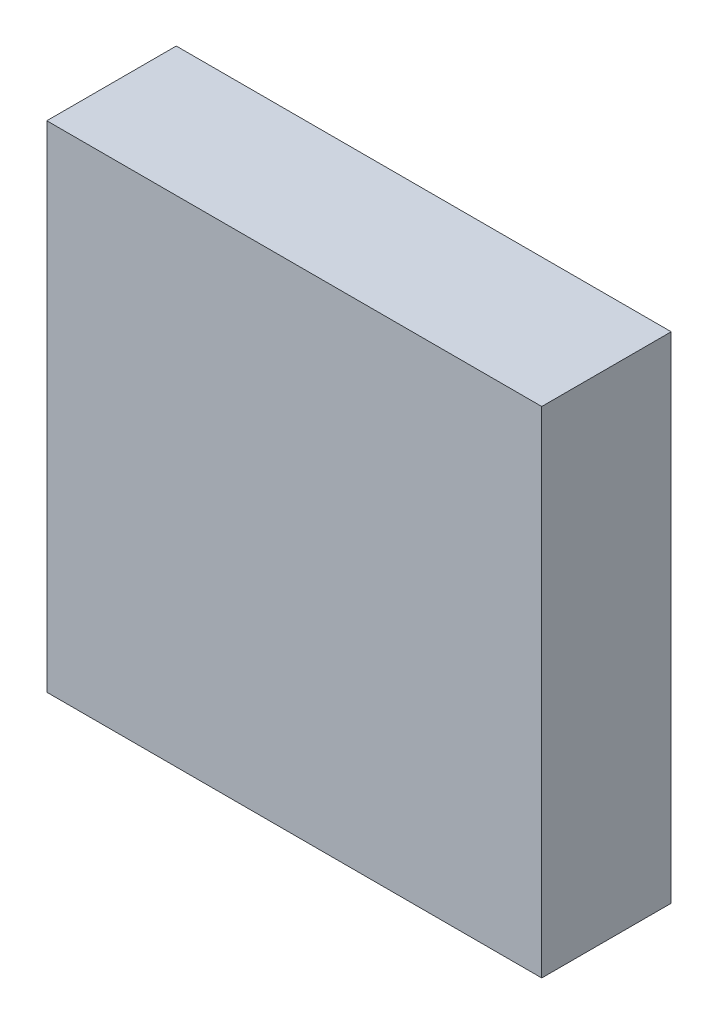
ISO-10303-21;
HEADER;
FILE_DESCRIPTION(('STEP AP214'),'2;1');
FILE_NAME('part.step','',(''),(''),'','','');
FILE_SCHEMA(('AUTOMOTIVE_DESIGN { 1 0 10303 214 1 1 1 1 }'));
ENDSEC;
DATA;
#1=APPLICATION_CONTEXT('core data for automotive mechanical design processes');
#2=APPLICATION_PROTOCOL_DEFINITION('international standard','automotive_design',2000,#1);
#3=PRODUCT_CONTEXT('',#1,'mechanical');
#4=PRODUCT('Part','Part','',(#3));
#5=PRODUCT_RELATED_PRODUCT_CATEGORY('part','',(#4));
#6=PRODUCT_DEFINITION_FORMATION('','',#4);
#7=PRODUCT_DEFINITION_CONTEXT('part definition',#1,'design');
#8=PRODUCT_DEFINITION('design','',#6,#7);
#9=PRODUCT_DEFINITION_SHAPE('','',#8);
#10=(LENGTH_UNIT() NAMED_UNIT(*) SI_UNIT(.MILLI.,.METRE.));
#11=(NAMED_UNIT(*) PLANE_ANGLE_UNIT() SI_UNIT($,.RADIAN.));
#12=(NAMED_UNIT(*) SI_UNIT($,.STERADIAN.) SOLID_ANGLE_UNIT());
#13=UNCERTAINTY_MEASURE_WITH_UNIT(LENGTH_MEASURE(1.E-05),#10,'distance_accuracy_value','');
#14=(GEOMETRIC_REPRESENTATION_CONTEXT(3) GLOBAL_UNCERTAINTY_ASSIGNED_CONTEXT((#13)) GLOBAL_UNIT_ASSIGNED_CONTEXT((#10,
#11,#12)) REPRESENTATION_CONTEXT('',''));
#15=CARTESIAN_POINT('',(0.,0.,0.));
#16=DIRECTION('',(0.,0.,1.));
#17=DIRECTION('',(1.,0.,0.));
#18=AXIS2_PLACEMENT_3D('',#15,#16,#17);
#19=CARTESIAN_POINT('',(3.25,-3.25,1.7));
#20=DIRECTION('',(0.,1.,0.));
#21=DIRECTION('',(0.,0.,1.));
#22=AXIS2_PLACEMENT_3D('',#19,#20,#21);
#23=PLANE('',#22);
#24=DIRECTION('',(1.,0.,0.));
#25=VECTOR('',#24,1.);
#26=CARTESIAN_POINT('',(3.25,-3.25,0.));
#27=LINE('',#26,#25);
#28=CARTESIAN_POINT('',(-3.25,-3.25,0.));
#29=VERTEX_POINT('',#28);
#30=CARTESIAN_POINT('',(3.25,-3.25,0.));
#31=VERTEX_POINT('',#30);
#32=EDGE_CURVE('E97',#29,#31,#27,.T.);
#33=ORIENTED_EDGE('',*,*,#32,.T.);
#34=DIRECTION('',(0.,0.,-1.));
#35=VECTOR('',#34,1.);
#36=CARTESIAN_POINT('',(3.25,-3.25,1.7));
#37=LINE('',#36,#35);
#38=CARTESIAN_POINT('',(3.25,-3.25,1.7));
#39=VERTEX_POINT('',#38);
#40=EDGE_CURVE('E11',#39,#31,#37,.T.);
#41=ORIENTED_EDGE('',*,*,#40,.F.);
#42=DIRECTION('',(1.,0.,0.));
#43=VECTOR('',#42,1.);
#44=CARTESIAN_POINT('',(3.25,-3.25,1.7));
#45=LINE('',#44,#43);
#46=CARTESIAN_POINT('',(-3.25,-3.25,1.7));
#47=VERTEX_POINT('',#46);
#48=EDGE_CURVE('E85',#47,#39,#45,.T.);
#49=ORIENTED_EDGE('',*,*,#48,.F.);
#50=DIRECTION('',(0.,0.,-1.));
#51=VECTOR('',#50,1.);
#52=CARTESIAN_POINT('',(-3.25,-3.25,1.7));
#53=LINE('',#52,#51);
#54=EDGE_CURVE('E93',#47,#29,#53,.T.);
#55=ORIENTED_EDGE('',*,*,#54,.T.);
#56=EDGE_LOOP('',(#33,#41,#49,#55));
#57=FACE_BOUND('',#56,.T.);
#58=ADVANCED_FACE('F34',(#57),#23,.F.);
#59=CARTESIAN_POINT('',(3.25,3.25,1.7));
#60=DIRECTION('',(-1.,0.,0.));
#61=DIRECTION('',(0.,0.,1.));
#62=AXIS2_PLACEMENT_3D('',#59,#60,#61);
#63=PLANE('',#62);
#64=DIRECTION('',(0.,1.,0.));
#65=VECTOR('',#64,1.);
#66=CARTESIAN_POINT('',(3.25,3.25,0.));
#67=LINE('',#66,#65);
#68=CARTESIAN_POINT('',(3.25,3.25,0.));
#69=VERTEX_POINT('',#68);
#70=EDGE_CURVE('E89',#31,#69,#67,.T.);
#71=ORIENTED_EDGE('',*,*,#70,.T.);
#72=DIRECTION('',(0.,0.,-1.));
#73=VECTOR('',#72,1.);
#74=CARTESIAN_POINT('',(3.25,3.25,1.7));
#75=LINE('',#74,#73);
#76=CARTESIAN_POINT('',(3.25,3.25,1.7));
#77=VERTEX_POINT('',#76);
#78=EDGE_CURVE('E42',#77,#69,#75,.T.);
#79=ORIENTED_EDGE('',*,*,#78,.F.);
#80=DIRECTION('',(0.,1.,0.));
#81=VECTOR('',#80,1.);
#82=CARTESIAN_POINT('',(3.25,3.25,1.7));
#83=LINE('',#82,#81);
#84=EDGE_CURVE('E80',#39,#77,#83,.T.);
#85=ORIENTED_EDGE('',*,*,#84,.F.);
#86=ORIENTED_EDGE('',*,*,#40,.T.);
#87=EDGE_LOOP('',(#71,#79,#85,#86));
#88=FACE_BOUND('',#87,.T.);
#89=ADVANCED_FACE('F88',(#88),#63,.F.);
#90=CARTESIAN_POINT('',(-3.25,3.25,1.7));
#91=DIRECTION('',(0.,-1.,0.));
#92=DIRECTION('',(0.,0.,-1.));
#93=AXIS2_PLACEMENT_3D('',#90,#91,#92);
#94=PLANE('',#93);
#95=DIRECTION('',(-1.,0.,0.));
#96=VECTOR('',#95,1.);
#97=CARTESIAN_POINT('',(-3.25,3.25,0.));
#98=LINE('',#97,#96);
#99=CARTESIAN_POINT('',(-3.25,3.25,0.));
#100=VERTEX_POINT('',#99);
#101=EDGE_CURVE('E67',#69,#100,#98,.T.);
#102=ORIENTED_EDGE('',*,*,#101,.T.);
#103=DIRECTION('',(0.,0.,-1.));
#104=VECTOR('',#103,1.);
#105=CARTESIAN_POINT('',(-3.25,3.25,1.7));
#106=LINE('',#105,#104);
#107=CARTESIAN_POINT('',(-3.25,3.25,1.7));
#108=VERTEX_POINT('',#107);
#109=EDGE_CURVE('E90',#108,#100,#106,.T.);
#110=ORIENTED_EDGE('',*,*,#109,.F.);
#111=DIRECTION('',(-1.,0.,0.));
#112=VECTOR('',#111,1.);
#113=CARTESIAN_POINT('',(-3.25,3.25,1.7));
#114=LINE('',#113,#112);
#115=EDGE_CURVE('E83',#77,#108,#114,.T.);
#116=ORIENTED_EDGE('',*,*,#115,.F.);
#117=ORIENTED_EDGE('',*,*,#78,.T.);
#118=EDGE_LOOP('',(#102,#110,#116,#117));
#119=FACE_BOUND('',#118,.T.);
#120=ADVANCED_FACE('F91',(#119),#94,.F.);
#121=CARTESIAN_POINT('',(-3.25,-3.25,1.7));
#122=DIRECTION('',(1.,0.,0.));
#123=DIRECTION('',(0.,0.,-1.));
#124=AXIS2_PLACEMENT_3D('',#121,#122,#123);
#125=PLANE('',#124);
#126=DIRECTION('',(0.,-1.,0.));
#127=VECTOR('',#126,1.);
#128=CARTESIAN_POINT('',(-3.25,-3.25,0.));
#129=LINE('',#128,#127);
#130=EDGE_CURVE('E73',#100,#29,#129,.T.);
#131=ORIENTED_EDGE('',*,*,#130,.T.);
#132=ORIENTED_EDGE('',*,*,#54,.F.);
#133=DIRECTION('',(0.,-1.,0.));
#134=VECTOR('',#133,1.);
#135=CARTESIAN_POINT('',(-3.25,-3.25,1.7));
#136=LINE('',#135,#134);
#137=EDGE_CURVE('E50',#108,#47,#136,.T.);
#138=ORIENTED_EDGE('',*,*,#137,.F.);
#139=ORIENTED_EDGE('',*,*,#109,.T.);
#140=EDGE_LOOP('',(#131,#132,#138,#139));
#141=FACE_BOUND('',#140,.T.);
#142=ADVANCED_FACE('F104',(#141),#125,.F.);
#143=CARTESIAN_POINT('',(0.,0.,1.7));
#144=DIRECTION('',(0.,0.,-1.));
#145=DIRECTION('',(-1.,0.,0.));
#146=AXIS2_PLACEMENT_3D('',#143,#144,#145);
#147=PLANE('',#146);
#148=ORIENTED_EDGE('',*,*,#48,.T.);
#149=ORIENTED_EDGE('',*,*,#84,.T.);
#150=ORIENTED_EDGE('',*,*,#115,.T.);
#151=ORIENTED_EDGE('',*,*,#137,.T.);
#152=EDGE_LOOP('',(#148,#149,#150,#151));
#153=FACE_BOUND('',#152,.T.);
#154=ADVANCED_FACE('F81',(#153),#147,.F.);
#155=CARTESIAN_POINT('',(0.,0.,0.));
#156=DIRECTION('',(0.,0.,-1.));
#157=DIRECTION('',(-1.,0.,0.));
#158=AXIS2_PLACEMENT_3D('',#155,#156,#157);
#159=PLANE('',#158);
#160=ORIENTED_EDGE('',*,*,#32,.F.);
#161=ORIENTED_EDGE('',*,*,#130,.F.);
#162=ORIENTED_EDGE('',*,*,#101,.F.);
#163=ORIENTED_EDGE('',*,*,#70,.F.);
#164=EDGE_LOOP('',(#160,#161,#162,#163));
#165=FACE_BOUND('',#164,.T.);
#166=ADVANCED_FACE('F107',(#165),#159,.T.);
#167=CLOSED_SHELL('',(#58,#89,#120,#142,#154,#166));
#168=MANIFOLD_SOLID_BREP('B2',#167);
#169=ADVANCED_BREP_SHAPE_REPRESENTATION('',(#18,#168),#14);
#170=SHAPE_DEFINITION_REPRESENTATION(#9,#169);
ENDSEC;
END-ISO-10303-21;
